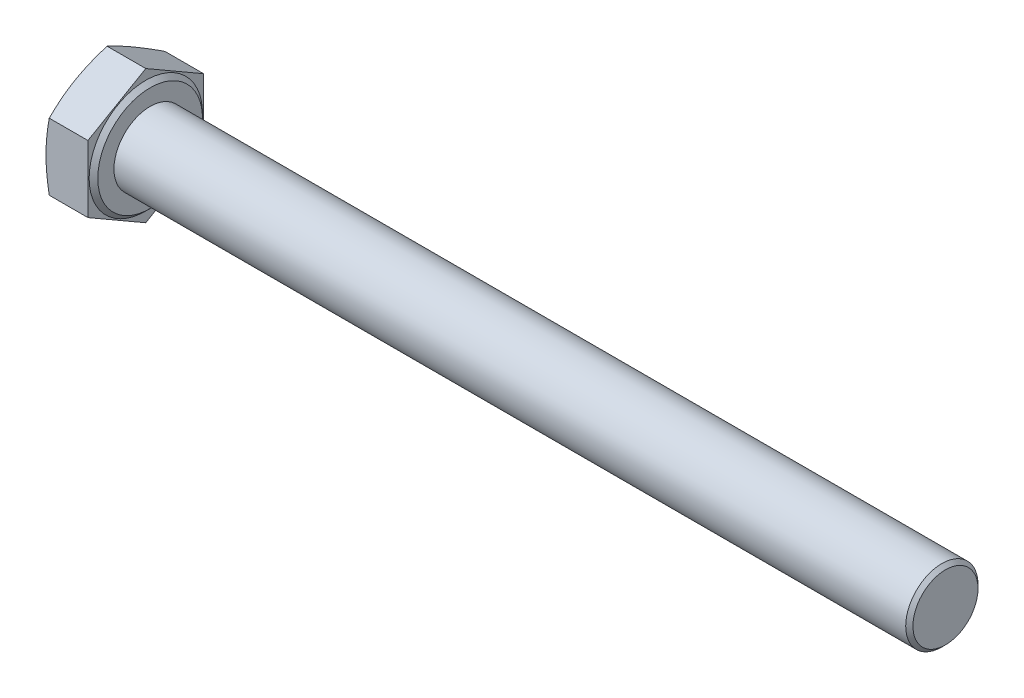
ISO-10303-21;
HEADER;
FILE_DESCRIPTION(('STEP AP214'),'2;1');
FILE_NAME('part.step','',(''),(''),'','','');
FILE_SCHEMA(('AUTOMOTIVE_DESIGN { 1 0 10303 214 1 1 1 1 }'));
ENDSEC;
DATA;
#1=APPLICATION_CONTEXT('core data for automotive mechanical design processes');
#2=APPLICATION_PROTOCOL_DEFINITION('international standard','automotive_design',2000,#1);
#3=PRODUCT_CONTEXT('',#1,'mechanical');
#4=PRODUCT('Part','Part','',(#3));
#5=PRODUCT_RELATED_PRODUCT_CATEGORY('part','',(#4));
#6=PRODUCT_DEFINITION_FORMATION('','',#4);
#7=PRODUCT_DEFINITION_CONTEXT('part definition',#1,'design');
#8=PRODUCT_DEFINITION('design','',#6,#7);
#9=PRODUCT_DEFINITION_SHAPE('','',#8);
#10=(LENGTH_UNIT() NAMED_UNIT(*) SI_UNIT(.MILLI.,.METRE.));
#11=(NAMED_UNIT(*) PLANE_ANGLE_UNIT() SI_UNIT($,.RADIAN.));
#12=(NAMED_UNIT(*) SI_UNIT($,.STERADIAN.) SOLID_ANGLE_UNIT());
#13=UNCERTAINTY_MEASURE_WITH_UNIT(LENGTH_MEASURE(1.E-05),#10,'distance_accuracy_value','');
#14=(GEOMETRIC_REPRESENTATION_CONTEXT(3) GLOBAL_UNCERTAINTY_ASSIGNED_CONTEXT((#13)) GLOBAL_UNIT_ASSIGNED_CONTEXT((#10,
#11,#12)) REPRESENTATION_CONTEXT('',''));
#15=CARTESIAN_POINT('',(0.,0.,0.));
#16=DIRECTION('',(0.,0.,1.));
#17=DIRECTION('',(1.,0.,0.));
#18=AXIS2_PLACEMENT_3D('',#15,#16,#17);
#19=CARTESIAN_POINT('',(6.4,-4.618802153517,8.));
#20=DIRECTION('',(-1.,0.,0.));
#21=DIRECTION('',(0.,0.,1.));
#22=AXIS2_PLACEMENT_3D('',#19,#20,#21);
#23=PLANE('',#22);
#24=CARTESIAN_POINT('',(6.4,0.,0.));
#25=DIRECTION('',(-1.,0.,0.));
#26=DIRECTION('',(0.,0.,1.));
#27=AXIS2_PLACEMENT_3D('',#24,#25,#26);
#28=CIRCLE('',#27,7.235);
#29=CARTESIAN_POINT('',(6.4,0.,7.235));
#30=VERTEX_POINT('',#29);
#31=EDGE_CURVE('E275',#30,#30,#28,.T.);
#32=ORIENTED_EDGE('',*,*,#31,.F.);
#33=EDGE_LOOP('',(#32));
#34=FACE_BOUND('',#33,.T.);
#35=CARTESIAN_POINT('',(6.4,0.,0.));
#36=DIRECTION('',(-1.,0.,0.));
#37=DIRECTION('',(0.,0.,1.));
#38=AXIS2_PLACEMENT_3D('',#35,#36,#37);
#39=CIRCLE('',#38,5.);
#40=CARTESIAN_POINT('',(6.4,0.,5.));
#41=VERTEX_POINT('',#40);
#42=EDGE_CURVE('E163',#41,#41,#39,.F.);
#43=ORIENTED_EDGE('',*,*,#42,.F.);
#44=EDGE_LOOP('',(#43));
#45=FACE_BOUND('',#44,.T.);
#46=ADVANCED_FACE('F45',(#34,#45),#23,.F.);
#47=CARTESIAN_POINT('',(6.4,-4.618802153517,8.));
#48=DIRECTION('',(0.,0.866025403784439,-0.5));
#49=DIRECTION('',(0.,0.5,0.866025403784439));
#50=AXIS2_PLACEMENT_3D('',#47,#48,#49);
#51=PLANE('',#50);
#52=CARTESIAN_POINT('',(0.450493158010576,-9.23771977708785,-0.000199999999995912));
#53=CARTESIAN_POINT('',(0.380845877657662,-9.04643550665614,0.331114075076469));
#54=CARTESIAN_POINT('',(0.317489662584086,-8.85452046971163,0.66352066980081));
#55=CARTESIAN_POINT('',(0.206024253769429,-8.46944256374963,1.33049516779923));
#56=CARTESIAN_POINT('',(0.157926990561577,-8.27627883822683,1.66506455458401));
#57=CARTESIAN_POINT('',(0.0801310629749314,-7.89084719500945,2.33265174348128));
#58=CARTESIAN_POINT('',(0.0502627163274098,-7.69858807938266,2.66565429996513));
#59=CARTESIAN_POINT('',(0.0102008734742893,-7.31362025543813,3.33243813031629));
#60=CARTESIAN_POINT('',(0.,-7.12091174285682,3.66621906515815));
#61=CARTESIAN_POINT('',(0.,-6.7354947176942,4.33378093484186));
#62=CARTESIAN_POINT('',(0.0102008734742893,-6.54278620511288,4.66756186968372));
#63=CARTESIAN_POINT('',(0.0502627163274099,-6.15781838116835,5.33434570003488));
#64=CARTESIAN_POINT('',(0.0801310629749316,-5.96555926554157,5.66734825651873));
#65=CARTESIAN_POINT('',(0.157926990561577,-5.58012762232419,6.33493544541599));
#66=CARTESIAN_POINT('',(0.20602425376943,-5.38696389680138,6.66950483220077));
#67=CARTESIAN_POINT('',(0.317489662584086,-5.00188599083938,7.33647933019919));
#68=CARTESIAN_POINT('',(0.380845877657662,-4.80997095389487,7.66888592492354));
#69=CARTESIAN_POINT('',(0.450493158010576,-4.61868668346317,8.0002));
#70=B_SPLINE_CURVE_WITH_KNOTS('',3,(#52,#53,#54,#55,#56,#57,#58,#59,#60,#61,#62,#63,#64,#65,#66,
#67,#68,#69),.UNSPECIFIED.,.F.,.F.,(4,2,2,2,2,2,2,2,4),(0.,1.16669003993239,2.33429004568844,
3.4908488399045,4.6469737244799,5.80309860905531,6.95965740327137,8.12725740902741,
9.2939474489598),.UNSPECIFIED.);
#71=CARTESIAN_POINT('',(0.45045112956002,-9.23760430703401,0.));
#72=VERTEX_POINT('',#71);
#73=CARTESIAN_POINT('',(0.,-6.92820323027551,4.));
#74=VERTEX_POINT('',#73);
#75=EDGE_CURVE('E294',#72,#74,#70,.T.);
#76=ORIENTED_EDGE('',*,*,#75,.F.);
#77=DIRECTION('',(-1.,0.,0.));
#78=VECTOR('',#77,1.);
#79=CARTESIAN_POINT('',(6.4,-9.23760430703401,0.));
#80=LINE('',#79,#78);
#81=CARTESIAN_POINT('',(5.8,-9.23760430703401,0.));
#82=VERTEX_POINT('',#81);
#83=EDGE_CURVE('E156',#82,#72,#80,.T.);
#84=ORIENTED_EDGE('',*,*,#83,.F.);
#85=DIRECTION('',(0.,-0.5,-0.866025403784439));
#86=VECTOR('',#85,1.);
#87=CARTESIAN_POINT('',(5.8,-4.618802153517,8.));
#88=LINE('',#87,#86);
#89=CARTESIAN_POINT('',(5.8,-4.618802153517,8.));
#90=VERTEX_POINT('',#89);
#91=EDGE_CURVE('E147',#90,#82,#88,.T.);
#92=ORIENTED_EDGE('',*,*,#91,.F.);
#93=DIRECTION('',(-1.,0.,0.));
#94=VECTOR('',#93,1.);
#95=CARTESIAN_POINT('',(6.4,-4.618802153517,8.));
#96=LINE('',#95,#94);
#97=CARTESIAN_POINT('',(0.45045112956002,-4.618802153517,8.));
#98=VERTEX_POINT('',#97);
#99=EDGE_CURVE('E142',#90,#98,#96,.T.);
#100=ORIENTED_EDGE('',*,*,#99,.T.);
#101=EDGE_CURVE('E136',#74,#98,#70,.T.);
#102=ORIENTED_EDGE('',*,*,#101,.F.);
#103=EDGE_LOOP('',(#76,#84,#92,#100,#102));
#104=FACE_BOUND('',#103,.T.);
#105=ADVANCED_FACE('F179',(#104),#51,.F.);
#106=CARTESIAN_POINT('',(6.4,-9.23760430703401,0.));
#107=DIRECTION('',(0.,0.866025403784439,0.5));
#108=DIRECTION('',(0.,-0.5,0.866025403784439));
#109=AXIS2_PLACEMENT_3D('',#106,#107,#108);
#110=PLANE('',#109);
#111=CARTESIAN_POINT('',(0.450493158010576,-4.61868668346317,-8.0002));
#112=CARTESIAN_POINT('',(0.380845877657662,-4.80997095389488,-7.66888592492353));
#113=CARTESIAN_POINT('',(0.317489662584086,-5.00188599083938,-7.33647933019919));
#114=CARTESIAN_POINT('',(0.206024253769429,-5.38696389680139,-6.66950483220077));
#115=CARTESIAN_POINT('',(0.157926990561576,-5.58012762232419,-6.33493544541599));
#116=CARTESIAN_POINT('',(0.0801310629749309,-5.96555926554157,-5.66734825651873));
#117=CARTESIAN_POINT('',(0.0502627163274094,-6.15781838116836,-5.33434570003487));
#118=CARTESIAN_POINT('',(0.0102008734742888,-6.54278620511289,-4.66756186968371));
#119=CARTESIAN_POINT('',(0.,-6.7354947176942,-4.33378093484186));
#120=CARTESIAN_POINT('',(0.,-7.12091174285682,-3.66621906515814));
#121=CARTESIAN_POINT('',(0.0102008734742887,-7.31362025543813,-3.33243813031628));
#122=CARTESIAN_POINT('',(0.0502627163274093,-7.69858807938266,-2.66565429996512));
#123=CARTESIAN_POINT('',(0.0801310629749309,-7.89084719500945,-2.33265174348127));
#124=CARTESIAN_POINT('',(0.157926990561576,-8.27627883822683,-1.66506455458401));
#125=CARTESIAN_POINT('',(0.206024253769429,-8.46944256374963,-1.33049516779922));
#126=CARTESIAN_POINT('',(0.317489662584086,-8.85452046971163,-0.663520669800803));
#127=CARTESIAN_POINT('',(0.380845877657662,-9.04643550665614,-0.331114075076462));
#128=CARTESIAN_POINT('',(0.450493158010576,-9.23771977708785,0.000200000000004466));
#129=B_SPLINE_CURVE_WITH_KNOTS('',3,(#111,#112,#113,#114,#115,#116,#117,#118,#119,#120,#121,
#122,#123,#124,#125,#126,#127,#128),.UNSPECIFIED.,.F.,.F.,(4,2,2,2,2,2,2,2,4),(0.,
1.16669003993239,2.33429004568844,3.4908488399045,4.6469737244799,5.80309860905531,
6.95965740327137,8.12725740902741,9.29394744895981),.UNSPECIFIED.);
#130=CARTESIAN_POINT('',(0.45045112956002,-4.618802153517,-8.));
#131=VERTEX_POINT('',#130);
#132=CARTESIAN_POINT('',(0.,-6.92820323027551,-4.));
#133=VERTEX_POINT('',#132);
#134=EDGE_CURVE('E244',#131,#133,#129,.T.);
#135=ORIENTED_EDGE('',*,*,#134,.F.);
#136=DIRECTION('',(-1.,0.,0.));
#137=VECTOR('',#136,1.);
#138=CARTESIAN_POINT('',(6.4,-4.61880215351701,-8.));
#139=LINE('',#138,#137);
#140=CARTESIAN_POINT('',(5.8,-4.618802153517,-8.));
#141=VERTEX_POINT('',#140);
#142=EDGE_CURVE('E153',#141,#131,#139,.T.);
#143=ORIENTED_EDGE('',*,*,#142,.F.);
#144=DIRECTION('',(0.,0.5,-0.866025403784439));
#145=VECTOR('',#144,1.);
#146=CARTESIAN_POINT('',(5.8,-9.23760430703401,0.));
#147=LINE('',#146,#145);
#148=EDGE_CURVE('E284',#82,#141,#147,.T.);
#149=ORIENTED_EDGE('',*,*,#148,.F.);
#150=ORIENTED_EDGE('',*,*,#83,.T.);
#151=EDGE_CURVE('E238',#133,#72,#129,.T.);
#152=ORIENTED_EDGE('',*,*,#151,.F.);
#153=EDGE_LOOP('',(#135,#143,#149,#150,#152));
#154=FACE_BOUND('',#153,.T.);
#155=ADVANCED_FACE('F186',(#154),#110,.F.);
#156=CARTESIAN_POINT('',(6.4,-4.61880215351701,-8.));
#157=DIRECTION('',(0.,0.,1.));
#158=DIRECTION('',(1.,0.,0.));
#159=AXIS2_PLACEMENT_3D('',#156,#157,#158);
#160=PLANE('',#159);
#161=CARTESIAN_POINT('',(2.40703219716245,-12.2289640200376,-8.));
#162=CARTESIAN_POINT('',(2.29681888523394,-11.8670150905868,-8.));
#163=CARTESIAN_POINT('',(2.18789161916434,-11.504667280153,-8.));
#164=CARTESIAN_POINT('',(1.97332061741836,-10.778970824763,-8.));
#165=CARTESIAN_POINT('',(1.86767714156927,-10.4156221030742,-8.));
#166=CARTESIAN_POINT('',(1.66020942200624,-9.68709884230832,-8.));
#167=CARTESIAN_POINT('',(1.55839267177542,-9.32192216153743,-8.));
#168=CARTESIAN_POINT('',(1.35977040010961,-8.59021038400077,-8.));
#169=CARTESIAN_POINT('',(1.26296478869846,-8.22367531175196,-8.));
#170=CARTESIAN_POINT('',(1.07676087846491,-7.49353181127823,-8.));
#171=CARTESIAN_POINT('',(0.987285967315624,-7.12994301830703,-8.));
#172=CARTESIAN_POINT('',(0.815953861079941,-6.40095616767066,-8.));
#173=CARTESIAN_POINT('',(0.734096794190527,-6.03555807966668,-8.));
#174=CARTESIAN_POINT('',(0.579908797559878,-5.30287087745679,-8.));
#175=CARTESIAN_POINT('',(0.507574618322042,-4.93558245297619,-8.));
#176=CARTESIAN_POINT('',(0.374634949913573,-4.19887324015162,-8.));
#177=CARTESIAN_POINT('',(0.314029067777133,-3.82945252367902,-8.));
#178=CARTESIAN_POINT('',(0.213008967359938,-3.13007695016431,-8.));
#179=CARTESIAN_POINT('',(0.171092736131273,-2.80034108865458,-8.));
#180=CARTESIAN_POINT('',(0.100138542385868,-2.13947507884516,-8.));
#181=CARTESIAN_POINT('',(0.0711002045940178,-1.80834497145915,-8.));
#182=CARTESIAN_POINT('',(0.0273002246760592,-1.14536212384039,-8.));
#183=CARTESIAN_POINT('',(0.0125284844304799,-0.813510061614981,-8.));
#184=CARTESIAN_POINT('',(-0.00199041013492818,-0.149473926383088,-8.));
#185=CARTESIAN_POINT('',(-0.00173767055719561,0.182710144262197,-8.));
#186=CARTESIAN_POINT('',(0.0138180095110685,0.848405447986301,-8.));
#187=CARTESIAN_POINT('',(0.0291972706417915,1.18191486795147,-8.));
#188=CARTESIAN_POINT('',(0.0742982363390947,1.8479541075051,-8.));
#189=CARTESIAN_POINT('',(0.104020285481667,2.18048390336563,-8.));
#190=CARTESIAN_POINT('',(0.17641644403375,2.84439969675765,-8.));
#191=CARTESIAN_POINT('',(0.219101678197378,3.17578446362416,-8.));
#192=CARTESIAN_POINT('',(0.315692777836971,3.83689615944751,-8.));
#193=CARTESIAN_POINT('',(0.369598703452479,4.16662307950908,-8.));
#194=CARTESIAN_POINT('',(0.48997875629475,4.84177010549688,-8.));
#195=CARTESIAN_POINT('',(0.556966861355307,5.18709775132953,-8.));
#196=CARTESIAN_POINT('',(0.699564842047327,5.87597970503131,-8.));
#197=CARTESIAN_POINT('',(0.775175367682242,6.21953387716333,-8.));
#198=CARTESIAN_POINT('',(0.933430517537683,6.90511369925111,-8.));
#199=CARTESIAN_POINT('',(1.01607718461399,7.24713887473675,-8.));
#200=CARTESIAN_POINT('',(1.18706021697481,7.92974842199475,-8.));
#201=CARTESIAN_POINT('',(1.27539644588225,8.27033282809352,-8.));
#202=CARTESIAN_POINT('',(1.45681143913803,8.95070023408333,-8.));
#203=CARTESIAN_POINT('',(1.54989614839366,9.29048164304365,-8.));
#204=CARTESIAN_POINT('',(1.73985237235277,9.96898283093708,-8.));
#205=CARTESIAN_POINT('',(1.83672390312131,10.3077026053598,-8.));
#206=CARTESIAN_POINT('',(2.03355925017499,10.9841773409885,-8.));
#207=CARTESIAN_POINT('',(2.13352253137674,11.3219324582152,-8.));
#208=CARTESIAN_POINT('',(2.33602454440187,11.996670628208,-8.));
#209=CARTESIAN_POINT('',(2.43856329306407,12.3336536759105,-8.));
#210=CARTESIAN_POINT('',(2.74708830104615,13.3361794606142,-8.));
#211=CARTESIAN_POINT('',(2.95617894291984,14.0007666415726,-8.));
#212=CARTESIAN_POINT('',(3.38028544248689,15.3280732019443,-8.));
#213=CARTESIAN_POINT('',(3.59530158446308,15.9907924900561,-8.));
#214=CARTESIAN_POINT('',(4.02885489365638,17.3122918141811,-8.));
#215=CARTESIAN_POINT('',(4.24737560533565,17.9710772558801,-8.));
#216=CARTESIAN_POINT('',(4.57758071171983,18.9584130764373,-8.));
#217=CARTESIAN_POINT('',(4.6880485882439,19.2873713919596,-8.));
#218=CARTESIAN_POINT('',(4.90969914478166,19.9450462651023,-8.));
#219=CARTESIAN_POINT('',(5.02088182305299,20.2737628233098,-8.));
#220=CARTESIAN_POINT('',(5.13237415450081,20.6023743750219,-8.));
#221=B_SPLINE_CURVE_WITH_KNOTS('',3,(#161,#162,#163,#164,#165,#166,#167,#168,#169,#170,#171,
#172,#173,#174,#175,#176,#177,#178,#179,#180,#181,#182,#183,#184,#185,#186,#187,#188,#189,#190,
#191,#192,#193,#194,#195,#196,#197,#198,#199,#200,#201,#202,#203,#204,#205,#206,#207,#208,#209,
#210,#211,#212,#213,#214,#215,#216,#217,#218,#219,#220),.UNSPECIFIED.,.F.,.F.,(4,2,2,2,2,2,2,2,
2,2,2,2,2,2,2,2,2,2,2,2,2,2,2,2,2,2,2,2,2,4),(0.,1.13507897087121,2.27024752651691,
3.40753402381049,4.54480009377602,5.66804425909984,6.79130732353531,7.91418609773198,
9.0370272424768,10.033976502705,11.0308967088931,12.0271107611941,13.0233177782613,
14.0245770623107,15.0258604021495,16.0280054638286,17.0301558968431,18.08531583255,
19.1405553644161,20.1961023236154,21.2516239910864,22.3085012120079,23.3653829170713,
24.4220827220175,25.4787894376352,27.5688531460001,29.6590173027929,31.7412506742,
32.7822834922737,33.8233137737492),.UNSPECIFIED.);
#222=CARTESIAN_POINT('',(0.45045112956002,4.61880215351701,-8.));
#223=VERTEX_POINT('',#222);
#224=CARTESIAN_POINT('',(0.,0.,-8.));
#225=VERTEX_POINT('',#224);
#226=EDGE_CURVE('E319',#223,#225,#221,.F.);
#227=ORIENTED_EDGE('',*,*,#226,.F.);
#228=DIRECTION('',(-1.,0.,0.));
#229=VECTOR('',#228,1.);
#230=CARTESIAN_POINT('',(6.4,4.61880215351701,-8.));
#231=LINE('',#230,#229);
#232=CARTESIAN_POINT('',(5.8,4.61880215351701,-8.));
#233=VERTEX_POINT('',#232);
#234=EDGE_CURVE('E144',#233,#223,#231,.T.);
#235=ORIENTED_EDGE('',*,*,#234,.F.);
#236=DIRECTION('',(0.,1.,0.));
#237=VECTOR('',#236,1.);
#238=CARTESIAN_POINT('',(5.8,-4.61880215351701,-8.));
#239=LINE('',#238,#237);
#240=EDGE_CURVE('E277',#141,#233,#239,.T.);
#241=ORIENTED_EDGE('',*,*,#240,.F.);
#242=ORIENTED_EDGE('',*,*,#142,.T.);
#243=EDGE_CURVE('E245',#225,#131,#221,.F.);
#244=ORIENTED_EDGE('',*,*,#243,.F.);
#245=EDGE_LOOP('',(#227,#235,#241,#242,#244));
#246=FACE_BOUND('',#245,.T.);
#247=ADVANCED_FACE('F254',(#246),#160,.F.);
#248=CARTESIAN_POINT('',(6.4,4.61880215351701,-8.));
#249=DIRECTION('',(0.,-0.866025403784439,0.5));
#250=DIRECTION('',(0.,-0.5,-0.866025403784439));
#251=AXIS2_PLACEMENT_3D('',#248,#249,#250);
#252=PLANE('',#251);
#253=CARTESIAN_POINT('',(0.450493158010576,9.23771977708785,0.000199999999998359));
#254=CARTESIAN_POINT('',(0.380845877657661,9.04643550665614,-0.331114075076467));
#255=CARTESIAN_POINT('',(0.317489662584086,8.85452046971163,-0.663520669800807));
#256=CARTESIAN_POINT('',(0.206024253769429,8.46944256374963,-1.33049516779923));
#257=CARTESIAN_POINT('',(0.157926990561577,8.27627883822683,-1.66506455458401));
#258=CARTESIAN_POINT('',(0.0801310629749311,7.89084719500945,-2.33265174348127));
#259=CARTESIAN_POINT('',(0.0502627163274093,7.69858807938266,-2.66565429996513));
#260=CARTESIAN_POINT('',(0.0102008734742888,7.31362025543813,-3.33243813031629));
#261=CARTESIAN_POINT('',(0.,7.12091174285682,-3.66621906515814));
#262=CARTESIAN_POINT('',(0.,6.7354947176942,-4.33378093484186));
#263=CARTESIAN_POINT('',(0.0102008734742892,6.54278620511288,-4.66756186968372));
#264=CARTESIAN_POINT('',(0.0502627163274099,6.15781838116835,-5.33434570003488));
#265=CARTESIAN_POINT('',(0.0801310629749318,5.96555926554157,-5.66734825651873));
#266=CARTESIAN_POINT('',(0.157926990561577,5.58012762232419,-6.33493544541599));
#267=CARTESIAN_POINT('',(0.20602425376943,5.38696389680138,-6.66950483220077));
#268=CARTESIAN_POINT('',(0.317489662584086,5.00188599083938,-7.33647933019919));
#269=CARTESIAN_POINT('',(0.380845877657662,4.80997095389488,-7.66888592492354));
#270=CARTESIAN_POINT('',(0.450493158010577,4.61868668346317,-8.0002));
#271=B_SPLINE_CURVE_WITH_KNOTS('',3,(#253,#254,#255,#256,#257,#258,#259,#260,#261,#262,#263,
#264,#265,#266,#267,#268,#269,#270),.UNSPECIFIED.,.F.,.F.,(4,2,2,2,2,2,2,2,4),(0.,
1.16669003993239,2.33429004568844,3.4908488399045,4.6469737244799,5.80309860905531,
6.95965740327137,8.12725740902741,9.29394744895981),.UNSPECIFIED.);
#272=CARTESIAN_POINT('',(0.45045112956002,9.23760430703401,0.));
#273=VERTEX_POINT('',#272);
#274=CARTESIAN_POINT('',(0.,6.92820323027551,-4.));
#275=VERTEX_POINT('',#274);
#276=EDGE_CURVE('E232',#273,#275,#271,.T.);
#277=ORIENTED_EDGE('',*,*,#276,.F.);
#278=DIRECTION('',(-1.,0.,0.));
#279=VECTOR('',#278,1.);
#280=CARTESIAN_POINT('',(6.4,9.23760430703401,0.));
#281=LINE('',#280,#279);
#282=CARTESIAN_POINT('',(5.8,9.23760430703401,0.));
#283=VERTEX_POINT('',#282);
#284=EDGE_CURVE('E141',#283,#273,#281,.T.);
#285=ORIENTED_EDGE('',*,*,#284,.F.);
#286=DIRECTION('',(0.,0.5,0.866025403784439));
#287=VECTOR('',#286,1.);
#288=CARTESIAN_POINT('',(5.8,4.61880215351701,-8.));
#289=LINE('',#288,#287);
#290=EDGE_CURVE('E274',#233,#283,#289,.T.);
#291=ORIENTED_EDGE('',*,*,#290,.F.);
#292=ORIENTED_EDGE('',*,*,#234,.T.);
#293=EDGE_CURVE('E271',#275,#223,#271,.T.);
#294=ORIENTED_EDGE('',*,*,#293,.F.);
#295=EDGE_LOOP('',(#277,#285,#291,#292,#294));
#296=FACE_BOUND('',#295,.T.);
#297=ADVANCED_FACE('F259',(#296),#252,.F.);
#298=CARTESIAN_POINT('',(6.4,9.23760430703401,0.));
#299=DIRECTION('',(0.,-0.866025403784439,-0.5));
#300=DIRECTION('',(0.,0.5,-0.866025403784439));
#301=AXIS2_PLACEMENT_3D('',#298,#299,#300);
#302=PLANE('',#301);
#303=CARTESIAN_POINT('',(0.450493158010577,4.61868668346317,8.0002));
#304=CARTESIAN_POINT('',(0.380845877657663,4.80997095389488,7.66888592492354));
#305=CARTESIAN_POINT('',(0.317489662584086,5.00188599083938,7.33647933019919));
#306=CARTESIAN_POINT('',(0.20602425376943,5.38696389680138,6.66950483220077));
#307=CARTESIAN_POINT('',(0.157926990561577,5.58012762232419,6.33493544541599));
#308=CARTESIAN_POINT('',(0.0801310629749317,5.96555926554157,5.66734825651873));
#309=CARTESIAN_POINT('',(0.0502627163274099,6.15781838116835,5.33434570003487));
#310=CARTESIAN_POINT('',(0.0102008734742892,6.54278620511289,4.66756186968371));
#311=CARTESIAN_POINT('',(0.,6.7354947176942,4.33378093484186));
#312=CARTESIAN_POINT('',(0.,7.12091174285682,3.66621906515814));
#313=CARTESIAN_POINT('',(0.010200873474289,7.31362025543813,3.33243813031628));
#314=CARTESIAN_POINT('',(0.0502627163274093,7.69858807938266,2.66565429996512));
#315=CARTESIAN_POINT('',(0.0801310629749309,7.89084719500945,2.33265174348127));
#316=CARTESIAN_POINT('',(0.157926990561576,8.27627883822683,1.66506455458401));
#317=CARTESIAN_POINT('',(0.206024253769429,8.46944256374963,1.33049516779922));
#318=CARTESIAN_POINT('',(0.317489662584086,8.85452046971163,0.663520669800804));
#319=CARTESIAN_POINT('',(0.380845877657662,9.04643550665614,0.331114075076463));
#320=CARTESIAN_POINT('',(0.450493158010576,9.23771977708785,-0.000200000000002658));
#321=B_SPLINE_CURVE_WITH_KNOTS('',3,(#303,#304,#305,#306,#307,#308,#309,#310,#311,#312,#313,
#314,#315,#316,#317,#318,#319,#320),.UNSPECIFIED.,.F.,.F.,(4,2,2,2,2,2,2,2,4),(0.,
1.16669003993239,2.33429004568844,3.4908488399045,4.6469737244799,5.80309860905531,
6.95965740327137,8.12725740902741,9.29394744895981),.UNSPECIFIED.);
#322=CARTESIAN_POINT('',(0.45045112956002,4.618802153517,8.));
#323=VERTEX_POINT('',#322);
#324=CARTESIAN_POINT('',(0.,6.92820323027551,4.));
#325=VERTEX_POINT('',#324);
#326=EDGE_CURVE('E121',#323,#325,#321,.T.);
#327=ORIENTED_EDGE('',*,*,#326,.F.);
#328=DIRECTION('',(-1.,0.,0.));
#329=VECTOR('',#328,1.);
#330=CARTESIAN_POINT('',(6.4,4.61880215351701,8.));
#331=LINE('',#330,#329);
#332=CARTESIAN_POINT('',(5.8,4.61880215351701,8.));
#333=VERTEX_POINT('',#332);
#334=EDGE_CURVE('E133',#333,#323,#331,.T.);
#335=ORIENTED_EDGE('',*,*,#334,.F.);
#336=DIRECTION('',(0.,-0.5,0.866025403784439));
#337=VECTOR('',#336,1.);
#338=CARTESIAN_POINT('',(5.8,9.23760430703401,0.));
#339=LINE('',#338,#337);
#340=EDGE_CURVE('E68',#283,#333,#339,.T.);
#341=ORIENTED_EDGE('',*,*,#340,.F.);
#342=ORIENTED_EDGE('',*,*,#284,.T.);
#343=EDGE_CURVE('E135',#325,#273,#321,.T.);
#344=ORIENTED_EDGE('',*,*,#343,.F.);
#345=EDGE_LOOP('',(#327,#335,#341,#342,#344));
#346=FACE_BOUND('',#345,.T.);
#347=ADVANCED_FACE('F132',(#346),#302,.F.);
#348=CARTESIAN_POINT('',(6.4,4.61880215351701,8.));
#349=DIRECTION('',(0.,0.,-1.));
#350=DIRECTION('',(-1.,0.,0.));
#351=AXIS2_PLACEMENT_3D('',#348,#349,#350);
#352=PLANE('',#351);
#353=CARTESIAN_POINT('',(2.40703219716245,-12.2289640200376,8.));
#354=CARTESIAN_POINT('',(2.29681888523394,-11.8670150905868,8.));
#355=CARTESIAN_POINT('',(2.18789161916434,-11.504667280153,8.));
#356=CARTESIAN_POINT('',(1.97332061741836,-10.778970824763,8.));
#357=CARTESIAN_POINT('',(1.86767714156927,-10.4156221030742,8.));
#358=CARTESIAN_POINT('',(1.66020942200624,-9.68709884230832,8.));
#359=CARTESIAN_POINT('',(1.55839267177542,-9.32192216153742,8.));
#360=CARTESIAN_POINT('',(1.35977040010961,-8.59021038400077,8.));
#361=CARTESIAN_POINT('',(1.26296478869846,-8.22367531175196,8.));
#362=CARTESIAN_POINT('',(1.0767608784649,-7.49353181127822,8.));
#363=CARTESIAN_POINT('',(0.987285967315624,-7.12994301830702,8.));
#364=CARTESIAN_POINT('',(0.815953861079941,-6.40095616767065,8.));
#365=CARTESIAN_POINT('',(0.734096794190527,-6.03555807966668,8.));
#366=CARTESIAN_POINT('',(0.579908797559878,-5.30287087745679,8.));
#367=CARTESIAN_POINT('',(0.507574618322042,-4.93558245297619,8.));
#368=CARTESIAN_POINT('',(0.374634949913573,-4.19887324015161,8.));
#369=CARTESIAN_POINT('',(0.314029067777133,-3.82945252367902,8.));
#370=CARTESIAN_POINT('',(0.213008967359938,-3.13007695016431,8.));
#371=CARTESIAN_POINT('',(0.171092736131273,-2.80034108865457,8.));
#372=CARTESIAN_POINT('',(0.100138542385868,-2.13947507884516,8.));
#373=CARTESIAN_POINT('',(0.0711002045940183,-1.80834497145915,8.));
#374=CARTESIAN_POINT('',(0.0273002246760599,-1.14536212384039,8.));
#375=CARTESIAN_POINT('',(0.0125284844304806,-0.813510061614979,8.));
#376=CARTESIAN_POINT('',(-0.00199041013492763,-0.149473926383087,8.));
#377=CARTESIAN_POINT('',(-0.00173767055719514,0.182710144262198,8.));
#378=CARTESIAN_POINT('',(0.0138180095110693,0.848405447986303,8.));
#379=CARTESIAN_POINT('',(0.0291972706417927,1.18191486795148,8.));
#380=CARTESIAN_POINT('',(0.074298236339096,1.84795410750511,8.));
#381=CARTESIAN_POINT('',(0.104020285481668,2.18048390336563,8.));
#382=CARTESIAN_POINT('',(0.176416444033751,2.84439969675766,8.));
#383=CARTESIAN_POINT('',(0.219101678197379,3.17578446362417,8.));
#384=CARTESIAN_POINT('',(0.315692777836972,3.83689615944752,8.));
#385=CARTESIAN_POINT('',(0.36959870345248,4.16662307950908,8.));
#386=CARTESIAN_POINT('',(0.489978756294752,4.84177010549688,8.));
#387=CARTESIAN_POINT('',(0.556966861355309,5.18709775132954,8.));
#388=CARTESIAN_POINT('',(0.699564842047328,5.87597970503132,8.));
#389=CARTESIAN_POINT('',(0.775175367682244,6.21953387716334,8.));
#390=CARTESIAN_POINT('',(0.933430517537685,6.90511369925111,8.));
#391=CARTESIAN_POINT('',(1.016077184614,7.24713887473676,8.));
#392=CARTESIAN_POINT('',(1.18706021697481,7.92974842199476,8.));
#393=CARTESIAN_POINT('',(1.27539644588226,8.27033282809353,8.));
#394=CARTESIAN_POINT('',(1.45681143913804,8.95070023408334,8.));
#395=CARTESIAN_POINT('',(1.54989614839366,9.29048164304366,8.));
#396=CARTESIAN_POINT('',(1.73985237235277,9.96898283093709,8.));
#397=CARTESIAN_POINT('',(1.83672390312131,10.3077026053598,8.));
#398=CARTESIAN_POINT('',(2.03355925017499,10.9841773409885,8.));
#399=CARTESIAN_POINT('',(2.13352253137674,11.3219324582152,8.));
#400=CARTESIAN_POINT('',(2.33602454440187,11.996670628208,8.));
#401=CARTESIAN_POINT('',(2.43856329306407,12.3336536759105,8.));
#402=CARTESIAN_POINT('',(2.74708830104616,13.3361794606142,8.));
#403=CARTESIAN_POINT('',(2.95617894291985,14.0007666415726,8.));
#404=CARTESIAN_POINT('',(3.3802854424869,15.3280732019444,8.));
#405=CARTESIAN_POINT('',(3.59530158446308,15.9907924900561,8.));
#406=CARTESIAN_POINT('',(4.02885489365638,17.3122918141811,8.));
#407=CARTESIAN_POINT('',(4.24737560533565,17.9710772558801,8.));
#408=CARTESIAN_POINT('',(4.57758071171983,18.9584130764373,8.));
#409=CARTESIAN_POINT('',(4.6880485882439,19.2873713919596,8.));
#410=CARTESIAN_POINT('',(4.90969914478166,19.9450462651023,8.));
#411=CARTESIAN_POINT('',(5.02088182305299,20.2737628233098,8.));
#412=CARTESIAN_POINT('',(5.13237415450081,20.6023743750219,8.));
#413=B_SPLINE_CURVE_WITH_KNOTS('',3,(#353,#354,#355,#356,#357,#358,#359,#360,#361,#362,#363,
#364,#365,#366,#367,#368,#369,#370,#371,#372,#373,#374,#375,#376,#377,#378,#379,#380,#381,#382,
#383,#384,#385,#386,#387,#388,#389,#390,#391,#392,#393,#394,#395,#396,#397,#398,#399,#400,#401,
#402,#403,#404,#405,#406,#407,#408,#409,#410,#411,#412),.UNSPECIFIED.,.F.,.F.,(4,2,2,2,2,2,2,2,
2,2,2,2,2,2,2,2,2,2,2,2,2,2,2,2,2,2,2,2,2,4),(0.,1.13507897087121,2.27024752651691,
3.4075340238105,4.54480009377603,5.66804425909984,6.79130732353531,7.91418609773198,
9.0370272424768,10.033976502705,11.0308967088931,12.0271107611941,13.0233177782613,
14.0245770623107,15.0258604021495,16.0280054638286,17.0301558968431,18.0853158325501,
19.1405553644161,20.1961023236154,21.2516239910864,22.3085012120079,23.3653829170713,
24.4220827220175,25.4787894376352,27.5688531460001,29.6590173027929,31.7412506742,
32.7822834922737,33.8233137737492),.UNSPECIFIED.);
#414=CARTESIAN_POINT('',(0.,0.,8.));
#415=VERTEX_POINT('',#414);
#416=EDGE_CURVE('E127',#98,#415,#413,.T.);
#417=ORIENTED_EDGE('',*,*,#416,.F.);
#418=ORIENTED_EDGE('',*,*,#99,.F.);
#419=DIRECTION('',(0.,-1.,0.));
#420=VECTOR('',#419,1.);
#421=CARTESIAN_POINT('',(5.8,4.61880215351701,8.));
#422=LINE('',#421,#420);
#423=EDGE_CURVE('E140',#333,#90,#422,.T.);
#424=ORIENTED_EDGE('',*,*,#423,.F.);
#425=ORIENTED_EDGE('',*,*,#334,.T.);
#426=EDGE_CURVE('E118',#415,#323,#413,.T.);
#427=ORIENTED_EDGE('',*,*,#426,.F.);
#428=EDGE_LOOP('',(#417,#418,#424,#425,#427));
#429=FACE_BOUND('',#428,.T.);
#430=ADVANCED_FACE('F138',(#429),#352,.F.);
#431=CARTESIAN_POINT('',(5.8,7.83500000000001,0.));
#432=DIRECTION('',(1.,0.,0.));
#433=DIRECTION('',(0.,0.,-1.));
#434=AXIS2_PLACEMENT_3D('',#431,#432,#433);
#435=PLANE('',#434);
#436=CARTESIAN_POINT('',(5.8,0.,0.));
#437=DIRECTION('',(-1.,0.,0.));
#438=DIRECTION('',(0.,0.,1.));
#439=AXIS2_PLACEMENT_3D('',#436,#437,#438);
#440=CIRCLE('',#439,7.83500000000001);
#441=CARTESIAN_POINT('',(5.8,0.,7.83500000000001));
#442=VERTEX_POINT('',#441);
#443=EDGE_CURVE('E280',#442,#442,#440,.T.);
#444=ORIENTED_EDGE('',*,*,#443,.T.);
#445=EDGE_LOOP('',(#444));
#446=FACE_BOUND('',#445,.T.);
#447=ORIENTED_EDGE('',*,*,#91,.T.);
#448=ORIENTED_EDGE('',*,*,#148,.T.);
#449=ORIENTED_EDGE('',*,*,#240,.T.);
#450=ORIENTED_EDGE('',*,*,#290,.T.);
#451=ORIENTED_EDGE('',*,*,#340,.T.);
#452=ORIENTED_EDGE('',*,*,#423,.T.);
#453=EDGE_LOOP('',(#447,#448,#449,#450,#451,#452));
#454=FACE_BOUND('',#453,.T.);
#455=ADVANCED_FACE('F200',(#446,#454),#435,.T.);
#456=CARTESIAN_POINT('',(5.8,0.,0.));
#457=DIRECTION('',(-1.,0.,0.));
#458=DIRECTION('',(0.,0.,1.));
#459=AXIS2_PLACEMENT_3D('',#456,#457,#458);
#460=CONICAL_SURFACE('',#459,7.83500000000001,0.785398163397453);
#461=ORIENTED_EDGE('',*,*,#31,.T.);
#462=EDGE_LOOP('',(#461));
#463=FACE_BOUND('',#462,.T.);
#464=ORIENTED_EDGE('',*,*,#443,.F.);
#465=EDGE_LOOP('',(#464));
#466=FACE_BOUND('',#465,.T.);
#467=ADVANCED_FACE('F192',(#463,#466),#460,.T.);
#468=CARTESIAN_POINT('',(0.,0.,0.));
#469=DIRECTION('',(1.,0.,0.));
#470=DIRECTION('',(0.,0.,-1.));
#471=AXIS2_PLACEMENT_3D('',#468,#469,#470);
#472=CONICAL_SURFACE('',#471,8.,1.22173047639604);
#473=ORIENTED_EDGE('',*,*,#101,.T.);
#474=ORIENTED_EDGE('',*,*,#416,.T.);
#475=CARTESIAN_POINT('',(0.,0.,0.));
#476=DIRECTION('',(-1.,0.,0.));
#477=DIRECTION('',(0.,0.,1.));
#478=AXIS2_PLACEMENT_3D('',#475,#476,#477);
#479=CIRCLE('',#478,8.);
#480=EDGE_CURVE('E60',#74,#415,#479,.T.);
#481=ORIENTED_EDGE('',*,*,#480,.F.);
#482=EDGE_LOOP('',(#473,#474,#481));
#483=FACE_BOUND('',#482,.T.);
#484=ADVANCED_FACE('F298',(#483),#472,.T.);
#485=ORIENTED_EDGE('',*,*,#151,.T.);
#486=ORIENTED_EDGE('',*,*,#75,.T.);
#487=EDGE_CURVE('E161',#133,#74,#479,.T.);
#488=ORIENTED_EDGE('',*,*,#487,.F.);
#489=EDGE_LOOP('',(#485,#486,#488));
#490=FACE_BOUND('',#489,.T.);
#491=ADVANCED_FACE('F307',(#490),#472,.T.);
#492=ORIENTED_EDGE('',*,*,#243,.T.);
#493=ORIENTED_EDGE('',*,*,#134,.T.);
#494=EDGE_CURVE('E302',#225,#133,#479,.T.);
#495=ORIENTED_EDGE('',*,*,#494,.F.);
#496=EDGE_LOOP('',(#492,#493,#495));
#497=FACE_BOUND('',#496,.T.);
#498=ADVANCED_FACE('F219',(#497),#472,.T.);
#499=ORIENTED_EDGE('',*,*,#226,.T.);
#500=EDGE_CURVE('E303',#275,#225,#479,.T.);
#501=ORIENTED_EDGE('',*,*,#500,.F.);
#502=ORIENTED_EDGE('',*,*,#293,.T.);
#503=EDGE_LOOP('',(#499,#501,#502));
#504=FACE_BOUND('',#503,.T.);
#505=ADVANCED_FACE('F214',(#504),#472,.T.);
#506=ORIENTED_EDGE('',*,*,#276,.T.);
#507=EDGE_CURVE('E162',#325,#275,#479,.T.);
#508=ORIENTED_EDGE('',*,*,#507,.F.);
#509=ORIENTED_EDGE('',*,*,#343,.T.);
#510=EDGE_LOOP('',(#506,#508,#509));
#511=FACE_BOUND('',#510,.T.);
#512=ADVANCED_FACE('F218',(#511),#472,.T.);
#513=ORIENTED_EDGE('',*,*,#326,.T.);
#514=CARTESIAN_POINT('',(0.,0.,0.));
#515=DIRECTION('',(-1.,0.,0.));
#516=DIRECTION('',(0.,0.,1.));
#517=AXIS2_PLACEMENT_3D('',#514,#515,#516);
#518=CIRCLE('',#517,8.);
#519=EDGE_CURVE('E123',#415,#325,#518,.T.);
#520=ORIENTED_EDGE('',*,*,#519,.F.);
#521=ORIENTED_EDGE('',*,*,#426,.T.);
#522=EDGE_LOOP('',(#513,#520,#521));
#523=FACE_BOUND('',#522,.T.);
#524=ADVANCED_FACE('F120',(#523),#472,.T.);
#525=CARTESIAN_POINT('',(0.,-4.618802153517,8.));
#526=DIRECTION('',(-1.,0.,0.));
#527=DIRECTION('',(0.,0.,1.));
#528=AXIS2_PLACEMENT_3D('',#525,#526,#527);
#529=PLANE('',#528);
#530=ORIENTED_EDGE('',*,*,#480,.T.);
#531=ORIENTED_EDGE('',*,*,#519,.T.);
#532=ORIENTED_EDGE('',*,*,#507,.T.);
#533=ORIENTED_EDGE('',*,*,#500,.T.);
#534=ORIENTED_EDGE('',*,*,#494,.T.);
#535=ORIENTED_EDGE('',*,*,#487,.T.);
#536=EDGE_LOOP('',(#530,#531,#532,#533,#534,#535));
#537=FACE_BOUND('',#536,.T.);
#538=ADVANCED_FACE('F194',(#537),#529,.T.);
#539=CARTESIAN_POINT('',(116.4,0.,0.));
#540=DIRECTION('',(-1.,0.,0.));
#541=DIRECTION('',(0.,0.,1.));
#542=AXIS2_PLACEMENT_3D('',#539,#540,#541);
#543=CYLINDRICAL_SURFACE('',#542,5.);
#544=CARTESIAN_POINT('',(115.9,0.,0.));
#545=DIRECTION('',(1.,0.,0.));
#546=DIRECTION('',(0.,0.,-1.));
#547=AXIS2_PLACEMENT_3D('',#544,#545,#546);
#548=CIRCLE('',#547,5.);
#549=CARTESIAN_POINT('',(115.9,0.,-5.));
#550=VERTEX_POINT('',#549);
#551=EDGE_CURVE('E11',#550,#550,#548,.F.);
#552=ORIENTED_EDGE('',*,*,#551,.T.);
#553=EDGE_LOOP('',(#552));
#554=FACE_BOUND('',#553,.T.);
#555=ORIENTED_EDGE('',*,*,#42,.T.);
#556=EDGE_LOOP('',(#555));
#557=FACE_BOUND('',#556,.T.);
#558=ADVANCED_FACE('F175',(#554,#557),#543,.T.);
#559=CARTESIAN_POINT('',(116.4,0.,0.));
#560=DIRECTION('',(1.,0.,0.));
#561=DIRECTION('',(0.,0.,-1.));
#562=AXIS2_PLACEMENT_3D('',#559,#560,#561);
#563=PLANE('',#562);
#564=CARTESIAN_POINT('',(116.4,0.,0.));
#565=DIRECTION('',(1.,0.,0.));
#566=DIRECTION('',(0.,0.,-1.));
#567=AXIS2_PLACEMENT_3D('',#564,#565,#566);
#568=CIRCLE('',#567,4.50000000000003);
#569=CARTESIAN_POINT('',(116.4,0.,-4.50000000000003));
#570=VERTEX_POINT('',#569);
#571=EDGE_CURVE('E53',#570,#570,#568,.T.);
#572=ORIENTED_EDGE('',*,*,#571,.T.);
#573=EDGE_LOOP('',(#572));
#574=FACE_BOUND('',#573,.T.);
#575=ADVANCED_FACE('F168',(#574),#563,.T.);
#576=CARTESIAN_POINT('',(116.4,0.,0.));
#577=DIRECTION('',(-1.,0.,0.));
#578=DIRECTION('',(0.,0.,1.));
#579=AXIS2_PLACEMENT_3D('',#576,#577,#578);
#580=CONICAL_SURFACE('',#579,4.50000000000003,0.785398163397444);
#581=ORIENTED_EDGE('',*,*,#551,.F.);
#582=EDGE_LOOP('',(#581));
#583=FACE_BOUND('',#582,.T.);
#584=ORIENTED_EDGE('',*,*,#571,.F.);
#585=EDGE_LOOP('',(#584));
#586=FACE_BOUND('',#585,.T.);
#587=ADVANCED_FACE('F47',(#583,#586),#580,.T.);
#588=CLOSED_SHELL('',(#46,#105,#155,#247,#297,#347,#430,#455,#467,#484,#491,#498,#505,#512,#524,
#538,#558,#575,#587));
#589=MANIFOLD_SOLID_BREP('B2',#588);
#590=ADVANCED_BREP_SHAPE_REPRESENTATION('',(#18,#589),#14);
#591=SHAPE_DEFINITION_REPRESENTATION(#9,#590);
ENDSEC;
END-ISO-10303-21;
